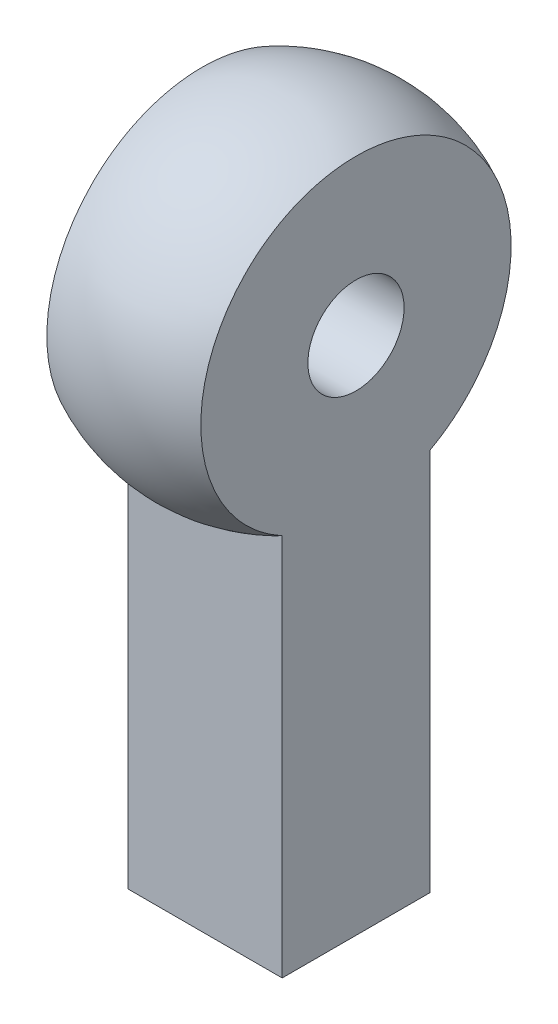
ISO-10303-21;
HEADER;
FILE_DESCRIPTION(('STEP AP214'),'2;1');
FILE_NAME('part.step','',(''),(''),'','','');
FILE_SCHEMA(('AUTOMOTIVE_DESIGN { 1 0 10303 214 1 1 1 1 }'));
ENDSEC;
DATA;
#1=APPLICATION_CONTEXT('core data for automotive mechanical design processes');
#2=APPLICATION_PROTOCOL_DEFINITION('international standard','automotive_design',2000,#1);
#3=PRODUCT_CONTEXT('',#1,'mechanical');
#4=PRODUCT('Part','Part','',(#3));
#5=PRODUCT_RELATED_PRODUCT_CATEGORY('part','',(#4));
#6=PRODUCT_DEFINITION_FORMATION('','',#4);
#7=PRODUCT_DEFINITION_CONTEXT('part definition',#1,'design');
#8=PRODUCT_DEFINITION('design','',#6,#7);
#9=PRODUCT_DEFINITION_SHAPE('','',#8);
#10=(LENGTH_UNIT() NAMED_UNIT(*) SI_UNIT(.MILLI.,.METRE.));
#11=(NAMED_UNIT(*) PLANE_ANGLE_UNIT() SI_UNIT($,.RADIAN.));
#12=(NAMED_UNIT(*) SI_UNIT($,.STERADIAN.) SOLID_ANGLE_UNIT());
#13=UNCERTAINTY_MEASURE_WITH_UNIT(LENGTH_MEASURE(1.E-05),#10,'distance_accuracy_value','');
#14=(GEOMETRIC_REPRESENTATION_CONTEXT(3) GLOBAL_UNCERTAINTY_ASSIGNED_CONTEXT((#13)) GLOBAL_UNIT_ASSIGNED_CONTEXT((#10,
#11,#12)) REPRESENTATION_CONTEXT('',''));
#15=CARTESIAN_POINT('',(0.,0.,0.));
#16=DIRECTION('',(0.,0.,1.));
#17=DIRECTION('',(1.,0.,0.));
#18=AXIS2_PLACEMENT_3D('',#15,#16,#17);
#19=CARTESIAN_POINT('',(0.,0.,0.));
#20=DIRECTION('',(0.,1.,0.));
#21=DIRECTION('',(0.,0.,-1.));
#22=AXIS2_PLACEMENT_3D('',#19,#20,#21);
#23=SPHERICAL_SURFACE('',#22,9.);
#24=CARTESIAN_POINT('',(0.,0.,3.83456192418029));
#25=DIRECTION('',(0.,0.,1.));
#26=DIRECTION('',(0.,-1.,0.));
#27=AXIS2_PLACEMENT_3D('',#24,#25,#26);
#28=CIRCLE('',#27,8.14224384611679);
#29=CARTESIAN_POINT('',(4.,-7.09197679421096,3.83456192418029));
#30=VERTEX_POINT('',#29);
#31=CARTESIAN_POINT('',(-4.,-7.09197679421096,3.83456192418029));
#32=VERTEX_POINT('',#31);
#33=EDGE_CURVE('E113',#30,#32,#28,.F.);
#34=ORIENTED_EDGE('',*,*,#33,.F.);
#35=CARTESIAN_POINT('',(4.,0.,0.));
#36=DIRECTION('',(1.,0.,0.));
#37=DIRECTION('',(0.,0.,-1.));
#38=AXIS2_PLACEMENT_3D('',#35,#36,#37);
#39=CIRCLE('',#38,8.06225774829855);
#40=CARTESIAN_POINT('',(4.,-7.09197679421096,-3.83456192418029));
#41=VERTEX_POINT('',#40);
#42=EDGE_CURVE('E12',#30,#41,#39,.F.);
#43=ORIENTED_EDGE('',*,*,#42,.T.);
#44=CARTESIAN_POINT('',(0.,0.,-3.83456192418029));
#45=DIRECTION('',(0.,0.,-1.));
#46=DIRECTION('',(-1.,0.,0.));
#47=AXIS2_PLACEMENT_3D('',#44,#45,#46);
#48=CIRCLE('',#47,8.14224384611679);
#49=CARTESIAN_POINT('',(-4.,-7.09197679421096,-3.83456192418029));
#50=VERTEX_POINT('',#49);
#51=EDGE_CURVE('E52',#50,#41,#48,.F.);
#52=ORIENTED_EDGE('',*,*,#51,.F.);
#53=CARTESIAN_POINT('',(-4.,0.,0.));
#54=DIRECTION('',(-1.,0.,0.));
#55=DIRECTION('',(0.,0.,1.));
#56=AXIS2_PLACEMENT_3D('',#53,#54,#55);
#57=CIRCLE('',#56,8.06225774829855);
#58=EDGE_CURVE('E46',#50,#32,#57,.F.);
#59=ORIENTED_EDGE('',*,*,#58,.T.);
#60=EDGE_LOOP('',(#34,#43,#52,#59));
#61=FACE_BOUND('',#60,.T.);
#62=ADVANCED_FACE('F38',(#61),#23,.T.);
#63=CARTESIAN_POINT('',(-4.,-29.4774502017861,-9.));
#64=DIRECTION('',(-1.,0.,0.));
#65=DIRECTION('',(0.,0.,1.));
#66=AXIS2_PLACEMENT_3D('',#63,#64,#65);
#67=PLANE('',#66);
#68=ORIENTED_EDGE('',*,*,#58,.F.);
#69=DIRECTION('',(0.,1.,0.));
#70=VECTOR('',#69,1.);
#71=CARTESIAN_POINT('',(-4.,-6.3232180074231,-3.83456192418029));
#72=LINE('',#71,#70);
#73=CARTESIAN_POINT('',(-4.,-27.,-3.83456192418029));
#74=VERTEX_POINT('',#73);
#75=EDGE_CURVE('E86',#74,#50,#72,.T.);
#76=ORIENTED_EDGE('',*,*,#75,.F.);
#77=DIRECTION('',(0.,0.,-1.));
#78=VECTOR('',#77,1.);
#79=CARTESIAN_POINT('',(-4.,-27.,3.83456192418029));
#80=LINE('',#79,#78);
#81=CARTESIAN_POINT('',(-4.,-27.,3.83456192418029));
#82=VERTEX_POINT('',#81);
#83=EDGE_CURVE('E83',#82,#74,#80,.T.);
#84=ORIENTED_EDGE('',*,*,#83,.F.);
#85=DIRECTION('',(0.,-1.,0.));
#86=VECTOR('',#85,1.);
#87=CARTESIAN_POINT('',(-4.,-6.3232180074231,3.83456192418029));
#88=LINE('',#87,#86);
#89=EDGE_CURVE('E100',#32,#82,#88,.T.);
#90=ORIENTED_EDGE('',*,*,#89,.F.);
#91=EDGE_LOOP('',(#68,#76,#84,#90));
#92=FACE_BOUND('',#91,.T.);
#93=CARTESIAN_POINT('',(-4.,0.,0.));
#94=DIRECTION('',(1.,0.,0.));
#95=DIRECTION('',(0.,0.,-1.));
#96=AXIS2_PLACEMENT_3D('',#93,#94,#95);
#97=CIRCLE('',#96,2.5);
#98=CARTESIAN_POINT('',(-4.,0.,-2.5));
#99=VERTEX_POINT('',#98);
#100=EDGE_CURVE('E115',#99,#99,#97,.T.);
#101=ORIENTED_EDGE('',*,*,#100,.T.);
#102=EDGE_LOOP('',(#101));
#103=FACE_BOUND('',#102,.T.);
#104=ADVANCED_FACE('F124',(#92,#103),#67,.T.);
#105=CARTESIAN_POINT('',(4.,-29.4774502017861,-9.));
#106=DIRECTION('',(1.,0.,0.));
#107=DIRECTION('',(0.,0.,-1.));
#108=AXIS2_PLACEMENT_3D('',#105,#106,#107);
#109=PLANE('',#108);
#110=ORIENTED_EDGE('',*,*,#42,.F.);
#111=DIRECTION('',(0.,-1.,0.));
#112=VECTOR('',#111,1.);
#113=CARTESIAN_POINT('',(4.,-6.3232180074231,3.83456192418029));
#114=LINE('',#113,#112);
#115=CARTESIAN_POINT('',(4.,-27.,3.83456192418029));
#116=VERTEX_POINT('',#115);
#117=EDGE_CURVE('E93',#30,#116,#114,.T.);
#118=ORIENTED_EDGE('',*,*,#117,.T.);
#119=DIRECTION('',(0.,0.,-1.));
#120=VECTOR('',#119,1.);
#121=CARTESIAN_POINT('',(4.,-27.,3.83456192418029));
#122=LINE('',#121,#120);
#123=CARTESIAN_POINT('',(4.,-27.,-3.83456192418029));
#124=VERTEX_POINT('',#123);
#125=EDGE_CURVE('E81',#116,#124,#122,.T.);
#126=ORIENTED_EDGE('',*,*,#125,.T.);
#127=DIRECTION('',(0.,1.,0.));
#128=VECTOR('',#127,1.);
#129=CARTESIAN_POINT('',(4.,-6.3232180074231,-3.83456192418029));
#130=LINE('',#129,#128);
#131=EDGE_CURVE('E89',#124,#41,#130,.T.);
#132=ORIENTED_EDGE('',*,*,#131,.T.);
#133=EDGE_LOOP('',(#110,#118,#126,#132));
#134=FACE_BOUND('',#133,.T.);
#135=CARTESIAN_POINT('',(4.,0.,0.));
#136=DIRECTION('',(1.,0.,0.));
#137=DIRECTION('',(0.,0.,-1.));
#138=AXIS2_PLACEMENT_3D('',#135,#136,#137);
#139=CIRCLE('',#138,2.5);
#140=CARTESIAN_POINT('',(4.,0.,-2.5));
#141=VERTEX_POINT('',#140);
#142=EDGE_CURVE('E41',#141,#141,#139,.T.);
#143=ORIENTED_EDGE('',*,*,#142,.F.);
#144=EDGE_LOOP('',(#143));
#145=FACE_BOUND('',#144,.T.);
#146=ADVANCED_FACE('F96',(#134,#145),#109,.T.);
#147=CARTESIAN_POINT('',(-4.,0.,0.));
#148=DIRECTION('',(1.,0.,0.));
#149=DIRECTION('',(0.,0.,-1.));
#150=AXIS2_PLACEMENT_3D('',#147,#148,#149);
#151=CYLINDRICAL_SURFACE('',#150,2.5);
#152=ORIENTED_EDGE('',*,*,#142,.T.);
#153=EDGE_LOOP('',(#152));
#154=FACE_BOUND('',#153,.T.);
#155=ORIENTED_EDGE('',*,*,#100,.F.);
#156=EDGE_LOOP('',(#155));
#157=FACE_BOUND('',#156,.T.);
#158=ADVANCED_FACE('F121',(#154,#157),#151,.F.);
#159=CARTESIAN_POINT('',(-26.0532259356776,-6.3232180074231,3.83456192418029));
#160=DIRECTION('',(0.,0.,1.));
#161=DIRECTION('',(0.,-1.,0.));
#162=AXIS2_PLACEMENT_3D('',#159,#160,#161);
#163=PLANE('',#162);
#164=ORIENTED_EDGE('',*,*,#117,.F.);
#165=ORIENTED_EDGE('',*,*,#33,.T.);
#166=ORIENTED_EDGE('',*,*,#89,.T.);
#167=DIRECTION('',(1.,0.,0.));
#168=VECTOR('',#167,1.);
#169=CARTESIAN_POINT('',(-26.0532259356776,-27.,3.83456192418029));
#170=LINE('',#169,#168);
#171=EDGE_CURVE('E102',#82,#116,#170,.T.);
#172=ORIENTED_EDGE('',*,*,#171,.T.);
#173=EDGE_LOOP('',(#164,#165,#166,#172));
#174=FACE_BOUND('',#173,.T.);
#175=ADVANCED_FACE('F129',(#174),#163,.T.);
#176=CARTESIAN_POINT('',(-26.0532259356776,-27.,3.83456192418029));
#177=DIRECTION('',(0.,-1.,0.));
#178=DIRECTION('',(0.,0.,-1.));
#179=AXIS2_PLACEMENT_3D('',#176,#177,#178);
#180=PLANE('',#179);
#181=CARTESIAN_POINT('',(0.,-27.,0.));
#182=DIRECTION('',(0.,-1.,0.));
#183=DIRECTION('',(0.,0.,-1.));
#184=AXIS2_PLACEMENT_3D('',#181,#182,#183);
#185=CIRCLE('',#184,2.);
#186=CARTESIAN_POINT('',(0.,-27.,-2.));
#187=VERTEX_POINT('',#186);
#188=EDGE_CURVE('E106',#187,#187,#185,.T.);
#189=ORIENTED_EDGE('',*,*,#188,.F.);
#190=EDGE_LOOP('',(#189));
#191=FACE_BOUND('',#190,.T.);
#192=ORIENTED_EDGE('',*,*,#171,.F.);
#193=ORIENTED_EDGE('',*,*,#83,.T.);
#194=DIRECTION('',(1.,0.,0.));
#195=VECTOR('',#194,1.);
#196=CARTESIAN_POINT('',(-26.0532259356776,-27.,-3.83456192418029));
#197=LINE('',#196,#195);
#198=EDGE_CURVE('E76',#74,#124,#197,.T.);
#199=ORIENTED_EDGE('',*,*,#198,.T.);
#200=ORIENTED_EDGE('',*,*,#125,.F.);
#201=EDGE_LOOP('',(#192,#193,#199,#200));
#202=FACE_BOUND('',#201,.T.);
#203=ADVANCED_FACE('F79',(#191,#202),#180,.T.);
#204=CARTESIAN_POINT('',(-26.0532259356776,-6.3232180074231,-3.83456192418029));
#205=DIRECTION('',(0.,0.,-1.));
#206=DIRECTION('',(-1.,0.,0.));
#207=AXIS2_PLACEMENT_3D('',#204,#205,#206);
#208=PLANE('',#207);
#209=ORIENTED_EDGE('',*,*,#75,.T.);
#210=ORIENTED_EDGE('',*,*,#51,.T.);
#211=ORIENTED_EDGE('',*,*,#131,.F.);
#212=ORIENTED_EDGE('',*,*,#198,.F.);
#213=EDGE_LOOP('',(#209,#210,#211,#212));
#214=FACE_BOUND('',#213,.T.);
#215=ADVANCED_FACE('F90',(#214),#208,.T.);
#216=CARTESIAN_POINT('',(0.,-12.,0.));
#217=DIRECTION('',(0.,-1.,0.));
#218=DIRECTION('',(0.,0.,-1.));
#219=AXIS2_PLACEMENT_3D('',#216,#217,#218);
#220=CYLINDRICAL_SURFACE('',#219,2.);
#221=CARTESIAN_POINT('',(0.,-12.,0.));
#222=DIRECTION('',(0.,-1.,0.));
#223=DIRECTION('',(0.,0.,-1.));
#224=AXIS2_PLACEMENT_3D('',#221,#222,#223);
#225=CIRCLE('',#224,2.);
#226=CARTESIAN_POINT('',(0.,-12.,-2.));
#227=VERTEX_POINT('',#226);
#228=EDGE_CURVE('E94',#227,#227,#225,.T.);
#229=ORIENTED_EDGE('',*,*,#228,.F.);
#230=EDGE_LOOP('',(#229));
#231=FACE_BOUND('',#230,.T.);
#232=ORIENTED_EDGE('',*,*,#188,.T.);
#233=EDGE_LOOP('',(#232));
#234=FACE_BOUND('',#233,.T.);
#235=ADVANCED_FACE('F150',(#231,#234),#220,.F.);
#236=CARTESIAN_POINT('',(0.,-12.,0.));
#237=DIRECTION('',(0.,-1.,0.));
#238=DIRECTION('',(0.,0.,-1.));
#239=AXIS2_PLACEMENT_3D('',#236,#237,#238);
#240=PLANE('',#239);
#241=ORIENTED_EDGE('',*,*,#228,.T.);
#242=EDGE_LOOP('',(#241));
#243=FACE_BOUND('',#242,.T.);
#244=ADVANCED_FACE('F153',(#243),#240,.T.);
#245=CLOSED_SHELL('',(#62,#104,#146,#158,#175,#203,#215,#235,#244));
#246=MANIFOLD_SOLID_BREP('B2',#245);
#247=ADVANCED_BREP_SHAPE_REPRESENTATION('',(#18,#246),#14);
#248=SHAPE_DEFINITION_REPRESENTATION(#9,#247);
ENDSEC;
END-ISO-10303-21;
